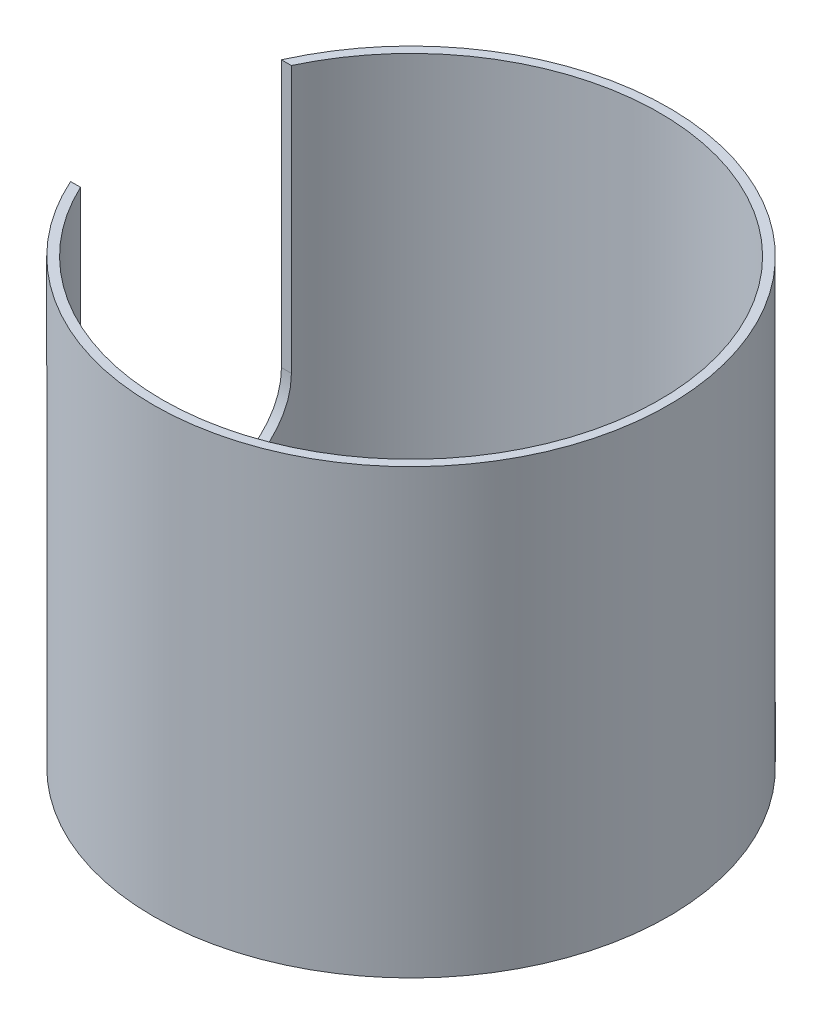
ISO-10303-21;
HEADER;
FILE_DESCRIPTION(('STEP AP214'),'2;1');
FILE_NAME('part.step','',(''),(''),'','','');
FILE_SCHEMA(('AUTOMOTIVE_DESIGN { 1 0 10303 214 1 1 1 1 }'));
ENDSEC;
DATA;
#1=APPLICATION_CONTEXT('core data for automotive mechanical design processes');
#2=APPLICATION_PROTOCOL_DEFINITION('international standard','automotive_design',2000,#1);
#3=PRODUCT_CONTEXT('',#1,'mechanical');
#4=PRODUCT('Part','Part','',(#3));
#5=PRODUCT_RELATED_PRODUCT_CATEGORY('part','',(#4));
#6=PRODUCT_DEFINITION_FORMATION('','',#4);
#7=PRODUCT_DEFINITION_CONTEXT('part definition',#1,'design');
#8=PRODUCT_DEFINITION('design','',#6,#7);
#9=PRODUCT_DEFINITION_SHAPE('','',#8);
#10=(LENGTH_UNIT() NAMED_UNIT(*) SI_UNIT(.MILLI.,.METRE.));
#11=(NAMED_UNIT(*) PLANE_ANGLE_UNIT() SI_UNIT($,.RADIAN.));
#12=(NAMED_UNIT(*) SI_UNIT($,.STERADIAN.) SOLID_ANGLE_UNIT());
#13=UNCERTAINTY_MEASURE_WITH_UNIT(LENGTH_MEASURE(1.E-05),#10,'distance_accuracy_value','');
#14=(GEOMETRIC_REPRESENTATION_CONTEXT(3) GLOBAL_UNCERTAINTY_ASSIGNED_CONTEXT((#13)) GLOBAL_UNIT_ASSIGNED_CONTEXT((#10,
#11,#12)) REPRESENTATION_CONTEXT('',''));
#15=CARTESIAN_POINT('',(0.,0.,0.));
#16=DIRECTION('',(0.,0.,1.));
#17=DIRECTION('',(1.,0.,0.));
#18=AXIS2_PLACEMENT_3D('',#15,#16,#17);
#19=CARTESIAN_POINT('',(0.,-1.,0.));
#20=DIRECTION('',(0.,1.,0.));
#21=DIRECTION('',(0.,0.,1.));
#22=AXIS2_PLACEMENT_3D('',#19,#20,#21);
#23=CYLINDRICAL_SURFACE('',#22,28.506);
#24=DIRECTION('',(0.,1.,0.));
#25=VECTOR('',#24,1.);
#26=CARTESIAN_POINT('',(-26.0095459399045,-1.,11.666));
#27=LINE('',#26,#25);
#28=CARTESIAN_POINT('',(-26.0095459399045,18.5,11.666));
#29=VERTEX_POINT('',#28);
#30=CARTESIAN_POINT('',(-26.0095459399045,48.,11.666));
#31=VERTEX_POINT('',#30);
#32=EDGE_CURVE('E98',#29,#31,#27,.T.);
#33=ORIENTED_EDGE('',*,*,#32,.F.);
#34=CARTESIAN_POINT('',(-26.0095459399044,18.5,-11.666));
#35=CARTESIAN_POINT('',(-26.0095434217543,18.3434110475346,-11.6660007180936));
#36=CARTESIAN_POINT('',(-26.0109605890379,18.1868429646959,-11.6628466229225));
#37=CARTESIAN_POINT('',(-26.0166080998332,17.8740171772068,-11.6502449851577));
#38=CARTESIAN_POINT('',(-26.0208383325842,17.7177594605791,-11.6407976903503));
#39=CARTESIAN_POINT('',(-26.0377025163269,17.2500302237939,-11.603055549608));
#40=CARTESIAN_POINT('',(-26.0545100168295,16.9394072632231,-11.56536040347));
#41=CARTESIAN_POINT('',(-26.0985945091018,16.3242318497538,-11.4655282590193));
#42=CARTESIAN_POINT('',(-26.1258285207887,16.0196598050145,-11.4034915754237));
#43=CARTESIAN_POINT('',(-26.1898732330131,15.4173616871469,-11.2556234585463));
#44=CARTESIAN_POINT('',(-26.2266845569163,15.11963606101,-11.169790476393));
#45=CARTESIAN_POINT('',(-26.3086723304575,14.5334051492358,-10.9752861947818));
#46=CARTESIAN_POINT('',(-26.3538368723123,14.2448874154769,-10.8666473763837));
#47=CARTESIAN_POINT('',(-26.4512244256501,13.6782971316068,-10.627390059795));
#48=CARTESIAN_POINT('',(-26.5034501302491,13.4002286187767,-10.4967631707099));
#49=CARTESIAN_POINT('',(-26.668599301643,12.5838078893275,-10.0732258788293));
#50=CARTESIAN_POINT('',(-26.7899962269836,12.0632310087401,-9.74865568249059));
#51=CARTESIAN_POINT('',(-27.0496463777298,11.0543366158144,-9.00398092501662));
#52=CARTESIAN_POINT('',(-27.1884551084619,10.5692617268943,-8.57967586431039));
#53=CARTESIAN_POINT('',(-27.3940333744536,9.89872861757279,-7.88778694105846));
#54=CARTESIAN_POINT('',(-27.462161169073,9.68461737384641,-7.64775500850853));
#55=CARTESIAN_POINT('',(-27.5958245862347,9.27664998125188,-7.15043233481005));
#56=CARTESIAN_POINT('',(-27.6613611628749,9.0827863331453,-6.89314804192493));
#57=CARTESIAN_POINT('',(-27.7908323788146,8.70888469331438,-6.35156815520446));
#58=CARTESIAN_POINT('',(-27.8545842751084,8.52976874077033,-6.06659204642236));
#59=CARTESIAN_POINT('',(-27.9756721087847,8.19631679035005,-5.48116167919044));
#60=CARTESIAN_POINT('',(-28.033007815532,8.04198168315471,-5.18070686491255));
#61=CARTESIAN_POINT('',(-28.1395940425385,7.75954480314605,-4.56644372989474));
#62=CARTESIAN_POINT('',(-28.1888473115995,7.63143410784178,-4.25263999497573));
#63=CARTESIAN_POINT('',(-28.2778347296365,7.40267732046666,-3.61386896765209));
#64=CARTESIAN_POINT('',(-28.3175695192825,7.30202937986845,-3.28890242827822));
#65=CARTESIAN_POINT('',(-28.3845816846965,7.1336614639302,-2.64696060739295));
#66=CARTESIAN_POINT('',(-28.4123860852702,7.06453730103415,-2.33040833790126));
#67=CARTESIAN_POINT('',(-28.4575445869149,6.95279325743722,-1.69192050772028));
#68=CARTESIAN_POINT('',(-28.4748990088884,6.91017256285491,-1.36998511265043));
#69=CARTESIAN_POINT('',(-28.4986559606672,6.85192637343821,-0.723380160293764));
#70=CARTESIAN_POINT('',(-28.5050619337159,6.83629239137513,-0.398711494902009));
#71=CARTESIAN_POINT('',(-28.5067462509086,6.83217631554202,0.250821263021946));
#72=CARTESIAN_POINT('',(-28.5020250079428,6.84369321430223,0.575685347855659));
#73=CARTESIAN_POINT('',(-28.4821968760328,6.89226527359311,1.20390984278396));
#74=CARTESIAN_POINT('',(-28.4677173895509,6.92777797461249,1.50741085519528));
#75=CARTESIAN_POINT('',(-28.4293979810147,7.02236698264655,2.11010300230016));
#76=CARTESIAN_POINT('',(-28.4055584966151,7.08144218792814,2.40929433782752));
#77=CARTESIAN_POINT('',(-28.3491155505132,7.22258666804662,3.00135422184855));
#78=CARTESIAN_POINT('',(-28.316511928838,7.30465636260624,3.29422265482399));
#79=CARTESIAN_POINT('',(-28.2433391329087,7.4910460325037,3.87176589344407));
#80=CARTESIAN_POINT('',(-28.2027697277559,7.59536665282149,4.15644046130441));
#81=CARTESIAN_POINT('',(-28.1139741030724,7.82710526489751,4.72007498288184));
#82=CARTESIAN_POINT('',(-28.0656423981586,7.95484550492619,4.99888569351234));
#83=CARTESIAN_POINT('',(-27.9629102141118,8.23139011131061,5.54480607904449));
#84=CARTESIAN_POINT('',(-27.908507557523,8.38020204058514,5.81191150748897));
#85=CARTESIAN_POINT('',(-27.7949146386684,8.69781702649237,6.33291865644108));
#86=CARTESIAN_POINT('',(-27.7357238872301,8.86662212653365,6.586819023498));
#87=CARTESIAN_POINT('',(-27.6139197135826,9.2231391987643,7.0801154267387));
#88=CARTESIAN_POINT('',(-27.5513061032025,9.41085221089054,7.31951066397804));
#89=CARTESIAN_POINT('',(-27.4197396455258,9.81753807751907,7.79844362711836));
#90=CARTESIAN_POINT('',(-27.3506459037721,10.0377702928588,8.03687448228815));
#91=CARTESIAN_POINT('',(-27.2119919531074,10.4972508155838,8.4945106412066));
#92=CARTESIAN_POINT('',(-27.1424317258993,10.7364998729085,8.71371518603753));
#93=CARTESIAN_POINT('',(-27.0046725683222,11.2327654993803,9.13171113461676));
#94=CARTESIAN_POINT('',(-26.9364742256612,11.4897895343652,9.3304938726063));
#95=CARTESIAN_POINT('',(-26.8033458790308,12.020127260501,9.70630940736203));
#96=CARTESIAN_POINT('',(-26.7384162604194,12.2934428640483,9.88333964320018));
#97=CARTESIAN_POINT('',(-26.6117439721025,12.863679545662,10.2196098736946));
#98=CARTESIAN_POINT('',(-26.5501665424821,13.1610733704223,10.3781121283992));
#99=CARTESIAN_POINT('',(-26.434533973898,13.7695389209746,10.6692073018055));
#100=CARTESIAN_POINT('',(-26.3804756133409,14.0806047132767,10.8018113266734));
#101=CARTESIAN_POINT('',(-26.2817909579061,14.7140067698811,11.039750511804));
#102=CARTESIAN_POINT('',(-26.2371526312597,15.0363280369134,11.1451204959942));
#103=CARTESIAN_POINT('',(-26.1588843168284,15.6900153076349,11.3276064451283));
#104=CARTESIAN_POINT('',(-26.125249405966,16.0213771943351,11.4047350474966));
#105=CARTESIAN_POINT('',(-26.0687984854275,16.7086090394532,11.5332144988676));
#106=CARTESIAN_POINT('',(-26.0466593272841,17.0648403914782,11.582961301857));
#107=CARTESIAN_POINT('',(-26.0244378189302,17.6017006847046,11.6327534972189));
#108=CARTESIAN_POINT('',(-26.0188618675316,17.7810450961065,11.6452128859581));
#109=CARTESIAN_POINT('',(-26.0114132338806,18.1402486661021,11.6618379109825));
#110=CARTESIAN_POINT('',(-26.009541668723,18.320107963595,11.6660010454514));
#111=CARTESIAN_POINT('',(-26.0095459399045,18.5,11.666));
#112=B_SPLINE_CURVE_WITH_KNOTS('',3,(#34,#35,#36,#37,#38,#39,#40,#41,#42,#43,#44,#45,#46,#47,
#48,#49,#50,#51,#52,#53,#54,#55,#56,#57,#58,#59,#60,#61,#62,#63,#64,#65,#66,#67,#68,#69,#70,#71,
#72,#73,#74,#75,#76,#77,#78,#79,#80,#81,#82,#83,#84,#85,#86,#87,#88,#89,#90,#91,#92,#93,#94,#95,
#96,#97,#98,#99,#100,#101,#102,#103,#104,#105,#106,#107,#108,#109,#110,#111),.UNSPECIFIED.,.F.,
.F.,(4,2,2,2,2,2,2,2,2,2,2,2,2,2,2,2,2,2,2,2,2,2,2,2,2,2,2,2,2,2,2,2,2,2,2,2,2,2,4),(0.,
0.469687298894936,0.939356105567538,1.87810971402303,2.81303455535912,3.74802026408079,
4.68168325222859,5.61570334776881,7.48371363129992,9.45222902304144,10.4376924358089,
11.4227895517545,12.4492406605518,13.4757286541216,14.5018668168206,15.5279358927627,
16.5022784770599,17.4765911392923,18.4505973276622,19.4245673747979,20.3412321023983,
21.2578539737092,22.1744925773811,23.0911577549535,24.0215389379639,24.9522548979822,
25.8830660643499,26.813928453398,27.8083644623485,28.8028397068969,29.7977352175256,
30.7927477454774,31.8191612156239,32.8451335486625,33.8697874159811,34.893982210279,
35.9730970394486,36.5124878410668,37.0520412766373),.UNSPECIFIED.);
#113=CARTESIAN_POINT('',(-26.0095459399045,18.5,-11.666));
#114=VERTEX_POINT('',#113);
#115=EDGE_CURVE('E93',#114,#29,#112,.T.);
#116=ORIENTED_EDGE('',*,*,#115,.F.);
#117=DIRECTION('',(0.,1.,0.));
#118=VECTOR('',#117,1.);
#119=CARTESIAN_POINT('',(-26.0095459399045,-1.,-11.666));
#120=LINE('',#119,#118);
#121=CARTESIAN_POINT('',(-26.0095459399045,48.,-11.666));
#122=VERTEX_POINT('',#121);
#123=EDGE_CURVE('E81',#122,#114,#120,.F.);
#124=ORIENTED_EDGE('',*,*,#123,.F.);
#125=CARTESIAN_POINT('',(0.,48.,0.));
#126=DIRECTION('',(0.,1.,0.));
#127=DIRECTION('',(0.,0.,1.));
#128=AXIS2_PLACEMENT_3D('',#125,#126,#127);
#129=CIRCLE('',#128,28.506);
#130=EDGE_CURVE('E102',#31,#122,#129,.T.);
#131=ORIENTED_EDGE('',*,*,#130,.F.);
#132=EDGE_LOOP('',(#33,#116,#124,#131));
#133=FACE_BOUND('',#132,.T.);
#134=CARTESIAN_POINT('',(0.,-1.,0.));
#135=DIRECTION('',(0.,1.,0.));
#136=DIRECTION('',(0.,0.,1.));
#137=AXIS2_PLACEMENT_3D('',#134,#135,#136);
#138=CIRCLE('',#137,28.506);
#139=CARTESIAN_POINT('',(0.,-1.,28.506));
#140=VERTEX_POINT('',#139);
#141=EDGE_CURVE('E137',#140,#140,#138,.T.);
#142=ORIENTED_EDGE('',*,*,#141,.T.);
#143=EDGE_LOOP('',(#142));
#144=FACE_BOUND('',#143,.T.);
#145=ADVANCED_FACE('F34',(#133,#144),#23,.T.);
#146=CARTESIAN_POINT('',(0.,-1.,0.));
#147=DIRECTION('',(0.,1.,0.));
#148=DIRECTION('',(0.,0.,1.));
#149=AXIS2_PLACEMENT_3D('',#146,#147,#148);
#150=PLANE('',#149);
#151=CARTESIAN_POINT('',(0.,-1.,0.));
#152=DIRECTION('',(0.,1.,0.));
#153=DIRECTION('',(0.,0.,1.));
#154=AXIS2_PLACEMENT_3D('',#151,#152,#153);
#155=CIRCLE('',#154,27.506);
#156=CARTESIAN_POINT('',(0.,-1.,27.506));
#157=VERTEX_POINT('',#156);
#158=EDGE_CURVE('E134',#157,#157,#155,.T.);
#159=ORIENTED_EDGE('',*,*,#158,.T.);
#160=EDGE_LOOP('',(#159));
#161=FACE_BOUND('',#160,.T.);
#162=ORIENTED_EDGE('',*,*,#141,.F.);
#163=EDGE_LOOP('',(#162));
#164=FACE_BOUND('',#163,.T.);
#165=ADVANCED_FACE('F124',(#161,#164),#150,.F.);
#166=CARTESIAN_POINT('',(0.,-1.,0.));
#167=DIRECTION('',(0.,1.,0.));
#168=DIRECTION('',(0.,0.,1.));
#169=AXIS2_PLACEMENT_3D('',#166,#167,#168);
#170=CYLINDRICAL_SURFACE('',#169,27.506);
#171=ORIENTED_EDGE('',*,*,#158,.F.);
#172=EDGE_LOOP('',(#171));
#173=FACE_BOUND('',#172,.T.);
#174=CARTESIAN_POINT('',(-24.9095258887037,18.5,-11.666));
#175=CARTESIAN_POINT('',(-24.9095232275798,18.3439798142826,-11.6660007817784));
#176=CARTESIAN_POINT('',(-24.9109923049538,18.1879805898609,-11.6628694784466));
#177=CARTESIAN_POINT('',(-24.9168463200453,17.8762940035257,-11.6503594262598));
#178=CARTESIAN_POINT('',(-24.921231137219,17.7206066289865,-11.6409809356786));
#179=CARTESIAN_POINT('',(-24.938710351625,17.2546006584137,-11.6035156882729));
#180=CARTESIAN_POINT('',(-24.9561295826651,16.9451338664023,-11.566099108175));
#181=CARTESIAN_POINT('',(-25.0018028385592,16.3323544917529,-11.4670320835987));
#182=CARTESIAN_POINT('',(-25.0300096660919,16.0290210774474,-11.4054871750749));
#183=CARTESIAN_POINT('',(-25.0963232758839,15.4291981538592,-11.2588215484085));
#184=CARTESIAN_POINT('',(-25.1344307705238,15.1327091387224,-11.1736991337692));
#185=CARTESIAN_POINT('',(-25.219275645768,14.5489693284296,-10.9808578288056));
#186=CARTESIAN_POINT('',(-25.2659995212559,14.2617048909395,-10.8731742648403));
#187=CARTESIAN_POINT('',(-25.366724541884,13.6975636046608,-10.6360655621926));
#188=CARTESIAN_POINT('',(-25.4207284699032,13.420690780176,-10.5066321046901));
#189=CARTESIAN_POINT('',(-25.5914762182493,12.607669836926,-10.0870099516747));
#190=CARTESIAN_POINT('',(-25.7169495000118,12.089161548209,-9.76551356988946));
#191=CARTESIAN_POINT('',(-25.9858671118454,11.0817330151291,-9.02648766341788));
#192=CARTESIAN_POINT('',(-26.12993144622,10.5962672616419,-8.6044735805093));
#193=CARTESIAN_POINT('',(-26.3433974754691,9.92473541511987,-7.91602787880456));
#194=CARTESIAN_POINT('',(-26.4141569444607,9.71022192324004,-7.6771451970042));
#195=CARTESIAN_POINT('',(-26.5530343103329,9.30129761224781,-7.18208744324179));
#196=CARTESIAN_POINT('',(-26.6211531765294,9.10687937202592,-6.92591881310525));
#197=CARTESIAN_POINT('',(-26.7560364739123,8.73100911595659,-6.3855771241624));
#198=CARTESIAN_POINT('',(-26.8225972311499,8.55055371283806,-6.10065956614149));
#199=CARTESIAN_POINT('',(-26.9490844865423,8.21443122047456,-5.51512233821986));
#200=CARTESIAN_POINT('',(-27.0090107257705,8.05876509858179,-5.21450205615932));
#201=CARTESIAN_POINT('',(-27.1204823830855,7.77371015175073,-4.59967748189852));
#202=CARTESIAN_POINT('',(-27.1720308262241,7.64431183781954,-4.28547814492748));
#203=CARTESIAN_POINT('',(-27.2652436287403,7.41306001323487,-3.64568153829083));
#204=CARTESIAN_POINT('',(-27.3069087088154,7.31120449407768,-3.3200851016929));
#205=CARTESIAN_POINT('',(-27.3771475444155,7.14088856703284,-2.67778549317907));
#206=CARTESIAN_POINT('',(-27.406304019674,7.07092891381357,-2.36154326303734));
#207=CARTESIAN_POINT('',(-27.4538110258881,6.95747334437274,-1.72354194896579));
#208=CARTESIAN_POINT('',(-27.472161910482,6.91397656209022,-1.40178304593672));
#209=CARTESIAN_POINT('',(-27.4975261447389,6.85396186638893,-0.755423284514383));
#210=CARTESIAN_POINT('',(-27.5045433476879,6.83743478364695,-0.430823429755719));
#211=CARTESIAN_POINT('',(-27.5070475347254,6.83152984683602,0.218661728951483));
#212=CARTESIAN_POINT('',(-27.5025349849342,6.84215089523286,0.543547020829667));
#213=CARTESIAN_POINT('',(-27.482759771253,6.88888429103328,1.1704884191353));
#214=CARTESIAN_POINT('',(-27.468193497635,6.92334563322688,1.47269133476112));
#215=CARTESIAN_POINT('',(-27.4294308433247,7.0156214696756,2.07286725587438));
#216=CARTESIAN_POINT('',(-27.4052349467664,7.07343478990054,2.37084047323214));
#217=CARTESIAN_POINT('',(-27.3478141380502,7.21184610418067,2.96055333575117));
#218=CARTESIAN_POINT('',(-27.3145890742602,7.29244448087974,3.25229287613785));
#219=CARTESIAN_POINT('',(-27.2399167109282,7.47568242066709,3.82768187909547));
#220=CARTESIAN_POINT('',(-27.1984691628389,7.57832265003935,4.1113310968174));
#221=CARTESIAN_POINT('',(-27.1076521933623,7.806476700477,4.67304967363229));
#222=CARTESIAN_POINT('',(-27.0581728581678,7.93231175081797,4.95097064443034));
#223=CARTESIAN_POINT('',(-26.9529040806402,8.20483820210183,5.49525891127817));
#224=CARTESIAN_POINT('',(-26.8971123786029,8.35153707674815,5.76162202232996));
#225=CARTESIAN_POINT('',(-26.7805143052259,8.66472737826635,6.2813235339116));
#226=CARTESIAN_POINT('',(-26.7197073944959,8.8312209349268,6.53466052870153));
#227=CARTESIAN_POINT('',(-26.5944592534648,9.18293050979295,7.02704211651899));
#228=CARTESIAN_POINT('',(-26.5300178090641,9.36814763145857,7.26608586586149));
#229=CARTESIAN_POINT('',(-26.3941849567293,9.7703436390703,7.74554995555688));
#230=CARTESIAN_POINT('',(-26.3226287006472,9.98865232296092,7.98480941087089));
#231=CARTESIAN_POINT('',(-26.1788518847486,10.444285666613,8.44427091468383));
#232=CARTESIAN_POINT('',(-26.1066312975057,10.6816111146188,8.66447217243323));
#233=CARTESIAN_POINT('',(-25.9634004278953,11.1740736520922,9.08466696536673));
#234=CARTESIAN_POINT('',(-25.89239072745,11.4292190210424,9.28465100019702));
#235=CARTESIAN_POINT('',(-25.753552464191,11.955880018948,9.6630849028346));
#236=CARTESIAN_POINT('',(-25.6857242903709,12.227397640451,9.84153214159075));
#237=CARTESIAN_POINT('',(-25.5528622161504,12.7953355581563,10.1816404181677));
#238=CARTESIAN_POINT('',(-25.4880162186621,13.0923000461546,10.3424681869609));
#239=CARTESIAN_POINT('',(-25.365996131962,13.7002197469837,10.6382270314909));
#240=CARTESIAN_POINT('',(-25.3088187367614,14.0111688532428,10.7731692775254));
#241=CARTESIAN_POINT('',(-25.204180370568,14.6446619762172,11.0157514195643));
#242=CARTESIAN_POINT('',(-25.1567064227449,14.9671898200851,11.1234278260063));
#243=CARTESIAN_POINT('',(-25.0731760753344,15.6216343340965,11.3104538770893));
#244=CARTESIAN_POINT('',(-25.0371145894988,15.9535467497197,11.3898161426473));
#245=CARTESIAN_POINT('',(-24.9753592425535,16.6520986270984,11.524647726427));
#246=CARTESIAN_POINT('',(-24.9507733475595,17.0193351016412,11.5775894117271));
#247=CARTESIAN_POINT('',(-24.9260830281822,17.5730424742874,11.6305952127373));
#248=CARTESIAN_POINT('',(-24.9198843441397,17.7580836676989,11.6438626907398));
#249=CARTESIAN_POINT('',(-24.9116025616115,18.1287374345143,11.6615670787273));
#250=CARTESIAN_POINT('',(-24.9095207455863,18.3143501679319,11.6660012370157));
#251=CARTESIAN_POINT('',(-24.9095258887037,18.5,11.666));
#252=B_SPLINE_CURVE_WITH_KNOTS('',3,(#174,#175,#176,#177,#178,#179,#180,#181,#182,#183,#184,
#185,#186,#187,#188,#189,#190,#191,#192,#193,#194,#195,#196,#197,#198,#199,#200,#201,#202,#203,
#204,#205,#206,#207,#208,#209,#210,#211,#212,#213,#214,#215,#216,#217,#218,#219,#220,#221,#222,
#223,#224,#225,#226,#227,#228,#229,#230,#231,#232,#233,#234,#235,#236,#237,#238,#239,#240,#241,
#242,#243,#244,#245,#246,#247,#248,#249,#250,#251),.UNSPECIFIED.,.F.,.F.,(4,2,2,2,2,2,2,2,2,2,2,
2,2,2,2,2,2,2,2,2,2,2,2,2,2,2,2,2,2,2,2,2,2,2,2,2,2,2,4),(0.,0.467980680240477,
0.935942014224277,1.87125380150392,2.80251942872993,3.73385208169181,4.66373720447922,
5.59397879926056,7.45459559738701,9.42300625455051,10.4084196080995,11.3934677417082,
12.4234689557349,13.4535103536582,14.4831789942846,15.5127725281048,16.4870930455206,
17.4613816742433,18.4353389893005,19.4092569302086,20.3217128317108,21.2341228648306,
22.14654822154,23.0590011630446,23.9851971291666,24.9117257107565,25.8383540716113,
26.765037074519,27.7590218159023,28.7530477792613,29.7475386989333,30.742150896098,
31.7724918405154,32.8023871600025,33.8308960128677,34.8589458374811,35.9722625413453,
36.5289007480224,37.0857123277918),.UNSPECIFIED.);
#253=CARTESIAN_POINT('',(-24.9095258887037,18.5,-11.666));
#254=VERTEX_POINT('',#253);
#255=CARTESIAN_POINT('',(-24.9095258887037,18.5,11.666));
#256=VERTEX_POINT('',#255);
#257=EDGE_CURVE('E11',#254,#256,#252,.T.);
#258=ORIENTED_EDGE('',*,*,#257,.T.);
#259=DIRECTION('',(0.,1.,0.));
#260=VECTOR('',#259,1.);
#261=CARTESIAN_POINT('',(-24.9095258887037,-1.,11.666));
#262=LINE('',#261,#260);
#263=CARTESIAN_POINT('',(-24.9095258887037,48.,11.666));
#264=VERTEX_POINT('',#263);
#265=EDGE_CURVE('E63',#256,#264,#262,.T.);
#266=ORIENTED_EDGE('',*,*,#265,.T.);
#267=CARTESIAN_POINT('',(0.,48.,0.));
#268=DIRECTION('',(0.,1.,0.));
#269=DIRECTION('',(0.,0.,1.));
#270=AXIS2_PLACEMENT_3D('',#267,#268,#269);
#271=CIRCLE('',#270,27.506);
#272=CARTESIAN_POINT('',(-24.9095258887037,48.,-11.666));
#273=VERTEX_POINT('',#272);
#274=EDGE_CURVE('E99',#264,#273,#271,.T.);
#275=ORIENTED_EDGE('',*,*,#274,.T.);
#276=DIRECTION('',(0.,1.,0.));
#277=VECTOR('',#276,1.);
#278=CARTESIAN_POINT('',(-24.9095258887037,-1.,-11.666));
#279=LINE('',#278,#277);
#280=EDGE_CURVE('E55',#273,#254,#279,.F.);
#281=ORIENTED_EDGE('',*,*,#280,.T.);
#282=EDGE_LOOP('',(#258,#266,#275,#281));
#283=FACE_BOUND('',#282,.T.);
#284=ADVANCED_FACE('F120',(#173,#283),#170,.F.);
#285=CARTESIAN_POINT('',(0.,48.,0.));
#286=DIRECTION('',(0.,1.,0.));
#287=DIRECTION('',(0.,0.,1.));
#288=AXIS2_PLACEMENT_3D('',#285,#286,#287);
#289=PLANE('',#288);
#290=DIRECTION('',(1.,0.,0.));
#291=VECTOR('',#290,1.);
#292=CARTESIAN_POINT('',(0.,48.,11.666));
#293=LINE('',#292,#291);
#294=EDGE_CURVE('E48',#31,#264,#293,.T.);
#295=ORIENTED_EDGE('',*,*,#294,.F.);
#296=ORIENTED_EDGE('',*,*,#130,.T.);
#297=DIRECTION('',(-1.,0.,0.));
#298=VECTOR('',#297,1.);
#299=CARTESIAN_POINT('',(0.,48.,-11.666));
#300=LINE('',#299,#298);
#301=EDGE_CURVE('E85',#273,#122,#300,.T.);
#302=ORIENTED_EDGE('',*,*,#301,.F.);
#303=ORIENTED_EDGE('',*,*,#274,.F.);
#304=EDGE_LOOP('',(#295,#296,#302,#303));
#305=FACE_BOUND('',#304,.T.);
#306=ADVANCED_FACE('F116',(#305),#289,.T.);
#307=CARTESIAN_POINT('',(-48.,18.5,0.));
#308=DIRECTION('',(1.,0.,0.));
#309=DIRECTION('',(0.,0.,-1.));
#310=AXIS2_PLACEMENT_3D('',#307,#308,#309);
#311=CYLINDRICAL_SURFACE('',#310,11.666);
#312=ORIENTED_EDGE('',*,*,#115,.T.);
#313=DIRECTION('',(1.,0.,0.));
#314=VECTOR('',#313,1.);
#315=CARTESIAN_POINT('',(-48.,18.5,11.666));
#316=LINE('',#315,#314);
#317=EDGE_CURVE('E94',#29,#256,#316,.T.);
#318=ORIENTED_EDGE('',*,*,#317,.T.);
#319=ORIENTED_EDGE('',*,*,#257,.F.);
#320=DIRECTION('',(1.,0.,0.));
#321=VECTOR('',#320,1.);
#322=CARTESIAN_POINT('',(-48.,18.5,-11.666));
#323=LINE('',#322,#321);
#324=EDGE_CURVE('E84',#114,#254,#323,.T.);
#325=ORIENTED_EDGE('',*,*,#324,.F.);
#326=EDGE_LOOP('',(#312,#318,#319,#325));
#327=FACE_BOUND('',#326,.T.);
#328=ADVANCED_FACE('F92',(#327),#311,.F.);
#329=CARTESIAN_POINT('',(-48.,18.5,11.666));
#330=DIRECTION('',(0.,0.,1.));
#331=DIRECTION('',(0.,-1.,0.));
#332=AXIS2_PLACEMENT_3D('',#329,#330,#331);
#333=PLANE('',#332);
#334=ORIENTED_EDGE('',*,*,#32,.T.);
#335=ORIENTED_EDGE('',*,*,#294,.T.);
#336=ORIENTED_EDGE('',*,*,#265,.F.);
#337=ORIENTED_EDGE('',*,*,#317,.F.);
#338=EDGE_LOOP('',(#334,#335,#336,#337));
#339=FACE_BOUND('',#338,.T.);
#340=ADVANCED_FACE('F115',(#339),#333,.F.);
#341=CARTESIAN_POINT('',(-48.,18.5,-11.666));
#342=DIRECTION('',(0.,0.,-1.));
#343=DIRECTION('',(0.,1.,0.));
#344=AXIS2_PLACEMENT_3D('',#341,#342,#343);
#345=PLANE('',#344);
#346=ORIENTED_EDGE('',*,*,#123,.T.);
#347=ORIENTED_EDGE('',*,*,#324,.T.);
#348=ORIENTED_EDGE('',*,*,#280,.F.);
#349=ORIENTED_EDGE('',*,*,#301,.T.);
#350=EDGE_LOOP('',(#346,#347,#348,#349));
#351=FACE_BOUND('',#350,.T.);
#352=ADVANCED_FACE('F83',(#351),#345,.F.);
#353=CLOSED_SHELL('',(#145,#165,#284,#306,#328,#340,#352));
#354=MANIFOLD_SOLID_BREP('B2',#353);
#355=ADVANCED_BREP_SHAPE_REPRESENTATION('',(#18,#354),#14);
#356=SHAPE_DEFINITION_REPRESENTATION(#9,#355);
ENDSEC;
END-ISO-10303-21;
